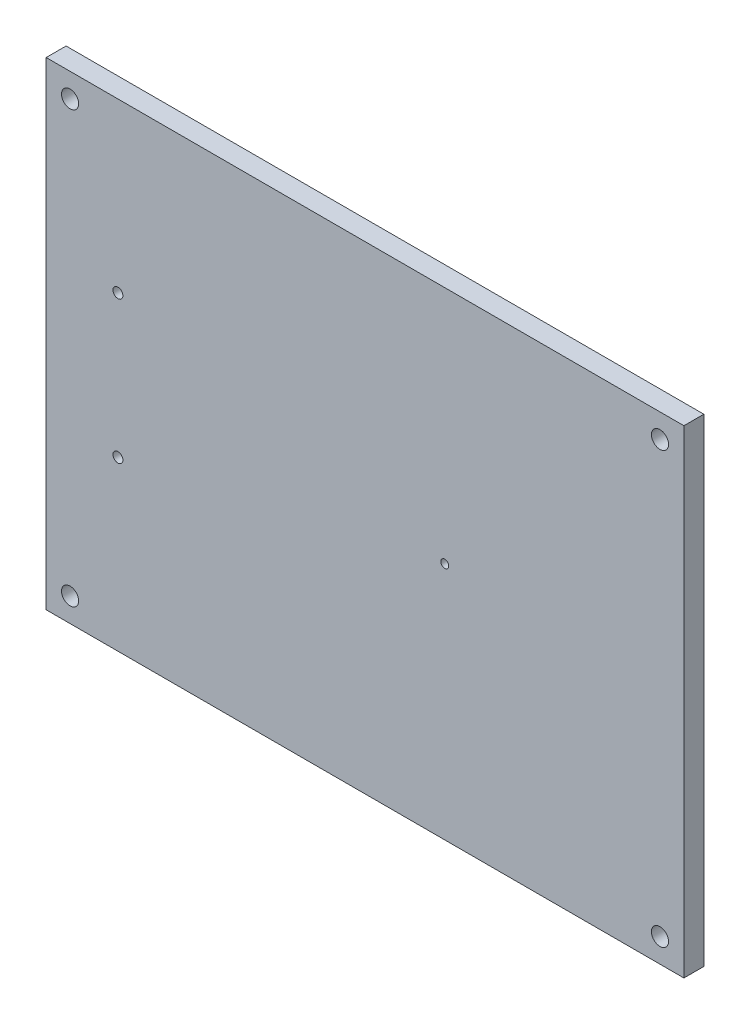
ISO-10303-21;
HEADER;
FILE_DESCRIPTION(('STEP AP214'),'2;1');
FILE_NAME('part.step','',(''),(''),'','','');
FILE_SCHEMA(('AUTOMOTIVE_DESIGN { 1 0 10303 214 1 1 1 1 }'));
ENDSEC;
DATA;
#1=APPLICATION_CONTEXT('core data for automotive mechanical design processes');
#2=APPLICATION_PROTOCOL_DEFINITION('international standard','automotive_design',2000,#1);
#3=PRODUCT_CONTEXT('',#1,'mechanical');
#4=PRODUCT('Part','Part','',(#3));
#5=PRODUCT_RELATED_PRODUCT_CATEGORY('part','',(#4));
#6=PRODUCT_DEFINITION_FORMATION('','',#4);
#7=PRODUCT_DEFINITION_CONTEXT('part definition',#1,'design');
#8=PRODUCT_DEFINITION('design','',#6,#7);
#9=PRODUCT_DEFINITION_SHAPE('','',#8);
#10=(LENGTH_UNIT() NAMED_UNIT(*) SI_UNIT(.MILLI.,.METRE.));
#11=(NAMED_UNIT(*) PLANE_ANGLE_UNIT() SI_UNIT($,.RADIAN.));
#12=(NAMED_UNIT(*) SI_UNIT($,.STERADIAN.) SOLID_ANGLE_UNIT());
#13=UNCERTAINTY_MEASURE_WITH_UNIT(LENGTH_MEASURE(1.E-05),#10,'distance_accuracy_value','');
#14=(GEOMETRIC_REPRESENTATION_CONTEXT(3) GLOBAL_UNCERTAINTY_ASSIGNED_CONTEXT((#13)) GLOBAL_UNIT_ASSIGNED_CONTEXT((#10,
#11,#12)) REPRESENTATION_CONTEXT('',''));
#15=CARTESIAN_POINT('',(0.,0.,0.));
#16=DIRECTION('',(0.,0.,1.));
#17=DIRECTION('',(1.,0.,0.));
#18=AXIS2_PLACEMENT_3D('',#15,#16,#17);
#19=CARTESIAN_POINT('',(0.,0.,5.));
#20=DIRECTION('',(0.,0.,1.));
#21=DIRECTION('',(1.,0.,0.));
#22=AXIS2_PLACEMENT_3D('',#19,#20,#21);
#23=PLANE('',#22);
#24=CARTESIAN_POINT('',(144.,59.,5.));
#25=DIRECTION('',(0.,0.,1.));
#26=DIRECTION('',(1.,0.,0.));
#27=AXIS2_PLACEMENT_3D('',#24,#25,#26);
#28=CIRCLE('',#27,2.15000000000001);
#29=CARTESIAN_POINT('',(146.15,59.,5.));
#30=VERTEX_POINT('',#29);
#31=EDGE_CURVE('E141',#30,#30,#28,.T.);
#32=ORIENTED_EDGE('',*,*,#31,.F.);
#33=EDGE_LOOP('',(#32));
#34=FACE_BOUND('',#33,.T.);
#35=CARTESIAN_POINT('',(-4.,-49.,5.));
#36=DIRECTION('',(0.,0.,1.));
#37=DIRECTION('',(1.,0.,0.));
#38=AXIS2_PLACEMENT_3D('',#35,#36,#37);
#39=CIRCLE('',#38,2.15);
#40=CARTESIAN_POINT('',(-1.85,-49.,5.));
#41=VERTEX_POINT('',#40);
#42=EDGE_CURVE('E129',#41,#41,#39,.T.);
#43=ORIENTED_EDGE('',*,*,#42,.F.);
#44=EDGE_LOOP('',(#43));
#45=FACE_BOUND('',#44,.T.);
#46=CARTESIAN_POINT('',(8.,-12.87,5.));
#47=DIRECTION('',(0.,0.,1.));
#48=DIRECTION('',(1.,0.,0.));
#49=AXIS2_PLACEMENT_3D('',#46,#47,#48);
#50=CIRCLE('',#49,1.25);
#51=CARTESIAN_POINT('',(9.25,-12.87,5.));
#52=VERTEX_POINT('',#51);
#53=EDGE_CURVE('E117',#52,#52,#50,.T.);
#54=ORIENTED_EDGE('',*,*,#53,.F.);
#55=EDGE_LOOP('',(#54));
#56=FACE_BOUND('',#55,.T.);
#57=DIRECTION('',(0.,-1.,0.));
#58=VECTOR('',#57,1.);
#59=CARTESIAN_POINT('',(-10.,65.,5.));
#60=LINE('',#59,#58);
#61=CARTESIAN_POINT('',(-10.,65.,5.));
#62=VERTEX_POINT('',#61);
#63=CARTESIAN_POINT('',(-10.,-55.,5.));
#64=VERTEX_POINT('',#63);
#65=EDGE_CURVE('E87',#62,#64,#60,.T.);
#66=ORIENTED_EDGE('',*,*,#65,.T.);
#67=DIRECTION('',(1.,0.,0.));
#68=VECTOR('',#67,1.);
#69=CARTESIAN_POINT('',(-10.,-55.,5.));
#70=LINE('',#69,#68);
#71=CARTESIAN_POINT('',(150.,-55.,5.));
#72=VERTEX_POINT('',#71);
#73=EDGE_CURVE('E82',#64,#72,#70,.T.);
#74=ORIENTED_EDGE('',*,*,#73,.T.);
#75=DIRECTION('',(0.,1.,0.));
#76=VECTOR('',#75,1.);
#77=CARTESIAN_POINT('',(150.,-55.,5.));
#78=LINE('',#77,#76);
#79=CARTESIAN_POINT('',(150.,65.,5.));
#80=VERTEX_POINT('',#79);
#81=EDGE_CURVE('E85',#72,#80,#78,.T.);
#82=ORIENTED_EDGE('',*,*,#81,.T.);
#83=DIRECTION('',(-1.,0.,0.));
#84=VECTOR('',#83,1.);
#85=CARTESIAN_POINT('',(150.,65.,5.));
#86=LINE('',#85,#84);
#87=EDGE_CURVE('E52',#80,#62,#86,.T.);
#88=ORIENTED_EDGE('',*,*,#87,.T.);
#89=EDGE_LOOP('',(#66,#74,#82,#88));
#90=FACE_BOUND('',#89,.T.);
#91=CARTESIAN_POINT('',(90.,5.,5.));
#92=DIRECTION('',(0.,0.,1.));
#93=DIRECTION('',(1.,0.,0.));
#94=AXIS2_PLACEMENT_3D('',#91,#92,#93);
#95=CIRCLE('',#94,1.);
#96=CARTESIAN_POINT('',(91.,5.,5.));
#97=VERTEX_POINT('',#96);
#98=EDGE_CURVE('E102',#97,#97,#95,.T.);
#99=ORIENTED_EDGE('',*,*,#98,.F.);
#100=EDGE_LOOP('',(#99));
#101=FACE_BOUND('',#100,.T.);
#102=CARTESIAN_POINT('',(8.,22.87,5.));
#103=DIRECTION('',(0.,0.,1.));
#104=DIRECTION('',(1.,0.,0.));
#105=AXIS2_PLACEMENT_3D('',#102,#103,#104);
#106=CIRCLE('',#105,1.25);
#107=CARTESIAN_POINT('',(9.25,22.87,5.));
#108=VERTEX_POINT('',#107);
#109=EDGE_CURVE('E123',#108,#108,#106,.T.);
#110=ORIENTED_EDGE('',*,*,#109,.F.);
#111=EDGE_LOOP('',(#110));
#112=FACE_BOUND('',#111,.T.);
#113=CARTESIAN_POINT('',(144.,-49.,5.));
#114=DIRECTION('',(0.,0.,1.));
#115=DIRECTION('',(1.,0.,0.));
#116=AXIS2_PLACEMENT_3D('',#113,#114,#115);
#117=CIRCLE('',#116,2.15000000000001);
#118=CARTESIAN_POINT('',(146.15,-49.,5.));
#119=VERTEX_POINT('',#118);
#120=EDGE_CURVE('E135',#119,#119,#117,.T.);
#121=ORIENTED_EDGE('',*,*,#120,.F.);
#122=EDGE_LOOP('',(#121));
#123=FACE_BOUND('',#122,.T.);
#124=CARTESIAN_POINT('',(-4.,59.,5.));
#125=DIRECTION('',(0.,0.,1.));
#126=DIRECTION('',(1.,0.,0.));
#127=AXIS2_PLACEMENT_3D('',#124,#125,#126);
#128=CIRCLE('',#127,2.15);
#129=CARTESIAN_POINT('',(-1.85,59.,5.));
#130=VERTEX_POINT('',#129);
#131=EDGE_CURVE('E147',#130,#130,#128,.T.);
#132=ORIENTED_EDGE('',*,*,#131,.F.);
#133=EDGE_LOOP('',(#132));
#134=FACE_BOUND('',#133,.T.);
#135=ADVANCED_FACE('F35',(#34,#45,#56,#90,#101,#112,#123,#134),#23,.T.);
#136=CARTESIAN_POINT('',(0.,0.,0.));
#137=DIRECTION('',(0.,0.,1.));
#138=DIRECTION('',(1.,0.,0.));
#139=AXIS2_PLACEMENT_3D('',#136,#137,#138);
#140=PLANE('',#139);
#141=DIRECTION('',(0.,-1.,0.));
#142=VECTOR('',#141,1.);
#143=CARTESIAN_POINT('',(-10.,65.,0.));
#144=LINE('',#143,#142);
#145=CARTESIAN_POINT('',(-10.,65.,0.));
#146=VERTEX_POINT('',#145);
#147=CARTESIAN_POINT('',(-10.,-55.,0.));
#148=VERTEX_POINT('',#147);
#149=EDGE_CURVE('E99',#146,#148,#144,.T.);
#150=ORIENTED_EDGE('',*,*,#149,.F.);
#151=DIRECTION('',(-1.,0.,0.));
#152=VECTOR('',#151,1.);
#153=CARTESIAN_POINT('',(150.,65.,0.));
#154=LINE('',#153,#152);
#155=CARTESIAN_POINT('',(150.,65.,0.));
#156=VERTEX_POINT('',#155);
#157=EDGE_CURVE('E75',#156,#146,#154,.T.);
#158=ORIENTED_EDGE('',*,*,#157,.F.);
#159=DIRECTION('',(0.,1.,0.));
#160=VECTOR('',#159,1.);
#161=CARTESIAN_POINT('',(150.,-55.,0.));
#162=LINE('',#161,#160);
#163=CARTESIAN_POINT('',(150.,-55.,0.));
#164=VERTEX_POINT('',#163);
#165=EDGE_CURVE('E69',#164,#156,#162,.T.);
#166=ORIENTED_EDGE('',*,*,#165,.F.);
#167=DIRECTION('',(1.,0.,0.));
#168=VECTOR('',#167,1.);
#169=CARTESIAN_POINT('',(-10.,-55.,0.));
#170=LINE('',#169,#168);
#171=EDGE_CURVE('E91',#148,#164,#170,.T.);
#172=ORIENTED_EDGE('',*,*,#171,.F.);
#173=EDGE_LOOP('',(#150,#158,#166,#172));
#174=FACE_BOUND('',#173,.T.);
#175=CARTESIAN_POINT('',(90.,5.,0.));
#176=DIRECTION('',(0.,0.,1.));
#177=DIRECTION('',(1.,0.,0.));
#178=AXIS2_PLACEMENT_3D('',#175,#176,#177);
#179=CIRCLE('',#178,1.);
#180=CARTESIAN_POINT('',(91.,5.,0.));
#181=VERTEX_POINT('',#180);
#182=EDGE_CURVE('E114',#181,#181,#179,.T.);
#183=ORIENTED_EDGE('',*,*,#182,.T.);
#184=EDGE_LOOP('',(#183));
#185=FACE_BOUND('',#184,.T.);
#186=CARTESIAN_POINT('',(8.,-12.87,0.));
#187=DIRECTION('',(0.,0.,1.));
#188=DIRECTION('',(1.,0.,0.));
#189=AXIS2_PLACEMENT_3D('',#186,#187,#188);
#190=CIRCLE('',#189,1.25);
#191=CARTESIAN_POINT('',(9.25,-12.87,0.));
#192=VERTEX_POINT('',#191);
#193=EDGE_CURVE('E120',#192,#192,#190,.T.);
#194=ORIENTED_EDGE('',*,*,#193,.T.);
#195=EDGE_LOOP('',(#194));
#196=FACE_BOUND('',#195,.T.);
#197=CARTESIAN_POINT('',(8.,22.87,0.));
#198=DIRECTION('',(0.,0.,1.));
#199=DIRECTION('',(1.,0.,0.));
#200=AXIS2_PLACEMENT_3D('',#197,#198,#199);
#201=CIRCLE('',#200,1.25);
#202=CARTESIAN_POINT('',(9.25,22.87,0.));
#203=VERTEX_POINT('',#202);
#204=EDGE_CURVE('E126',#203,#203,#201,.T.);
#205=ORIENTED_EDGE('',*,*,#204,.T.);
#206=EDGE_LOOP('',(#205));
#207=FACE_BOUND('',#206,.T.);
#208=CARTESIAN_POINT('',(-4.,-49.,0.));
#209=DIRECTION('',(0.,0.,1.));
#210=DIRECTION('',(1.,0.,0.));
#211=AXIS2_PLACEMENT_3D('',#208,#209,#210);
#212=CIRCLE('',#211,2.15);
#213=CARTESIAN_POINT('',(-1.85,-49.,0.));
#214=VERTEX_POINT('',#213);
#215=EDGE_CURVE('E132',#214,#214,#212,.T.);
#216=ORIENTED_EDGE('',*,*,#215,.T.);
#217=EDGE_LOOP('',(#216));
#218=FACE_BOUND('',#217,.T.);
#219=CARTESIAN_POINT('',(144.,-49.,0.));
#220=DIRECTION('',(0.,0.,1.));
#221=DIRECTION('',(1.,0.,0.));
#222=AXIS2_PLACEMENT_3D('',#219,#220,#221);
#223=CIRCLE('',#222,2.15000000000001);
#224=CARTESIAN_POINT('',(146.15,-49.,0.));
#225=VERTEX_POINT('',#224);
#226=EDGE_CURVE('E138',#225,#225,#223,.T.);
#227=ORIENTED_EDGE('',*,*,#226,.T.);
#228=EDGE_LOOP('',(#227));
#229=FACE_BOUND('',#228,.T.);
#230=CARTESIAN_POINT('',(144.,59.,0.));
#231=DIRECTION('',(0.,0.,1.));
#232=DIRECTION('',(1.,0.,0.));
#233=AXIS2_PLACEMENT_3D('',#230,#231,#232);
#234=CIRCLE('',#233,2.15000000000001);
#235=CARTESIAN_POINT('',(146.15,59.,0.));
#236=VERTEX_POINT('',#235);
#237=EDGE_CURVE('E144',#236,#236,#234,.T.);
#238=ORIENTED_EDGE('',*,*,#237,.T.);
#239=EDGE_LOOP('',(#238));
#240=FACE_BOUND('',#239,.T.);
#241=CARTESIAN_POINT('',(-4.,59.,0.));
#242=DIRECTION('',(0.,0.,1.));
#243=DIRECTION('',(1.,0.,0.));
#244=AXIS2_PLACEMENT_3D('',#241,#242,#243);
#245=CIRCLE('',#244,2.15);
#246=CARTESIAN_POINT('',(-1.85,59.,0.));
#247=VERTEX_POINT('',#246);
#248=EDGE_CURVE('E150',#247,#247,#245,.T.);
#249=ORIENTED_EDGE('',*,*,#248,.T.);
#250=EDGE_LOOP('',(#249));
#251=FACE_BOUND('',#250,.T.);
#252=ADVANCED_FACE('F110',(#174,#185,#196,#207,#218,#229,#240,#251),#140,.F.);
#253=CARTESIAN_POINT('',(-10.,65.,5.));
#254=DIRECTION('',(1.,0.,0.));
#255=DIRECTION('',(0.,0.,-1.));
#256=AXIS2_PLACEMENT_3D('',#253,#254,#255);
#257=PLANE('',#256);
#258=ORIENTED_EDGE('',*,*,#149,.T.);
#259=DIRECTION('',(0.,0.,-1.));
#260=VECTOR('',#259,1.);
#261=CARTESIAN_POINT('',(-10.,-55.,5.));
#262=LINE('',#261,#260);
#263=EDGE_CURVE('E11',#64,#148,#262,.T.);
#264=ORIENTED_EDGE('',*,*,#263,.F.);
#265=ORIENTED_EDGE('',*,*,#65,.F.);
#266=DIRECTION('',(0.,0.,-1.));
#267=VECTOR('',#266,1.);
#268=CARTESIAN_POINT('',(-10.,65.,5.));
#269=LINE('',#268,#267);
#270=EDGE_CURVE('E95',#62,#146,#269,.T.);
#271=ORIENTED_EDGE('',*,*,#270,.T.);
#272=EDGE_LOOP('',(#258,#264,#265,#271));
#273=FACE_BOUND('',#272,.T.);
#274=ADVANCED_FACE('F37',(#273),#257,.F.);
#275=CARTESIAN_POINT('',(-10.,-55.,5.));
#276=DIRECTION('',(0.,1.,0.));
#277=DIRECTION('',(0.,0.,1.));
#278=AXIS2_PLACEMENT_3D('',#275,#276,#277);
#279=PLANE('',#278);
#280=ORIENTED_EDGE('',*,*,#171,.T.);
#281=DIRECTION('',(0.,0.,-1.));
#282=VECTOR('',#281,1.);
#283=CARTESIAN_POINT('',(150.,-55.,5.));
#284=LINE('',#283,#282);
#285=EDGE_CURVE('E44',#72,#164,#284,.T.);
#286=ORIENTED_EDGE('',*,*,#285,.F.);
#287=ORIENTED_EDGE('',*,*,#73,.F.);
#288=ORIENTED_EDGE('',*,*,#263,.T.);
#289=EDGE_LOOP('',(#280,#286,#287,#288));
#290=FACE_BOUND('',#289,.T.);
#291=ADVANCED_FACE('F90',(#290),#279,.F.);
#292=CARTESIAN_POINT('',(150.,-55.,5.));
#293=DIRECTION('',(-1.,0.,0.));
#294=DIRECTION('',(0.,0.,1.));
#295=AXIS2_PLACEMENT_3D('',#292,#293,#294);
#296=PLANE('',#295);
#297=ORIENTED_EDGE('',*,*,#165,.T.);
#298=DIRECTION('',(0.,0.,-1.));
#299=VECTOR('',#298,1.);
#300=CARTESIAN_POINT('',(150.,65.,5.));
#301=LINE('',#300,#299);
#302=EDGE_CURVE('E92',#80,#156,#301,.T.);
#303=ORIENTED_EDGE('',*,*,#302,.F.);
#304=ORIENTED_EDGE('',*,*,#81,.F.);
#305=ORIENTED_EDGE('',*,*,#285,.T.);
#306=EDGE_LOOP('',(#297,#303,#304,#305));
#307=FACE_BOUND('',#306,.T.);
#308=ADVANCED_FACE('F93',(#307),#296,.F.);
#309=CARTESIAN_POINT('',(150.,65.,5.));
#310=DIRECTION('',(0.,-1.,0.));
#311=DIRECTION('',(0.,0.,-1.));
#312=AXIS2_PLACEMENT_3D('',#309,#310,#311);
#313=PLANE('',#312);
#314=ORIENTED_EDGE('',*,*,#157,.T.);
#315=ORIENTED_EDGE('',*,*,#270,.F.);
#316=ORIENTED_EDGE('',*,*,#87,.F.);
#317=ORIENTED_EDGE('',*,*,#302,.T.);
#318=EDGE_LOOP('',(#314,#315,#316,#317));
#319=FACE_BOUND('',#318,.T.);
#320=ADVANCED_FACE('F107',(#319),#313,.F.);
#321=CARTESIAN_POINT('',(90.,5.,5.));
#322=DIRECTION('',(0.,0.,-1.));
#323=DIRECTION('',(-1.,0.,0.));
#324=AXIS2_PLACEMENT_3D('',#321,#322,#323);
#325=CYLINDRICAL_SURFACE('',#324,1.);
#326=ORIENTED_EDGE('',*,*,#98,.T.);
#327=EDGE_LOOP('',(#326));
#328=FACE_BOUND('',#327,.T.);
#329=ORIENTED_EDGE('',*,*,#182,.F.);
#330=EDGE_LOOP('',(#329));
#331=FACE_BOUND('',#330,.T.);
#332=ADVANCED_FACE('F169',(#328,#331),#325,.F.);
#333=CARTESIAN_POINT('',(8.,-12.87,5.));
#334=DIRECTION('',(0.,0.,-1.));
#335=DIRECTION('',(-1.,0.,0.));
#336=AXIS2_PLACEMENT_3D('',#333,#334,#335);
#337=CYLINDRICAL_SURFACE('',#336,1.25);
#338=ORIENTED_EDGE('',*,*,#53,.T.);
#339=EDGE_LOOP('',(#338));
#340=FACE_BOUND('',#339,.T.);
#341=ORIENTED_EDGE('',*,*,#193,.F.);
#342=EDGE_LOOP('',(#341));
#343=FACE_BOUND('',#342,.T.);
#344=ADVANCED_FACE('F215',(#340,#343),#337,.F.);
#345=CARTESIAN_POINT('',(8.,22.87,5.));
#346=DIRECTION('',(0.,0.,-1.));
#347=DIRECTION('',(-1.,0.,0.));
#348=AXIS2_PLACEMENT_3D('',#345,#346,#347);
#349=CYLINDRICAL_SURFACE('',#348,1.25);
#350=ORIENTED_EDGE('',*,*,#109,.T.);
#351=EDGE_LOOP('',(#350));
#352=FACE_BOUND('',#351,.T.);
#353=ORIENTED_EDGE('',*,*,#204,.F.);
#354=EDGE_LOOP('',(#353));
#355=FACE_BOUND('',#354,.T.);
#356=ADVANCED_FACE('F223',(#352,#355),#349,.F.);
#357=CARTESIAN_POINT('',(-4.,-49.,5.));
#358=DIRECTION('',(0.,0.,-1.));
#359=DIRECTION('',(-1.,0.,0.));
#360=AXIS2_PLACEMENT_3D('',#357,#358,#359);
#361=CYLINDRICAL_SURFACE('',#360,2.15);
#362=ORIENTED_EDGE('',*,*,#42,.T.);
#363=EDGE_LOOP('',(#362));
#364=FACE_BOUND('',#363,.T.);
#365=ORIENTED_EDGE('',*,*,#215,.F.);
#366=EDGE_LOOP('',(#365));
#367=FACE_BOUND('',#366,.T.);
#368=ADVANCED_FACE('F231',(#364,#367),#361,.F.);
#369=CARTESIAN_POINT('',(144.,-49.,5.));
#370=DIRECTION('',(0.,0.,-1.));
#371=DIRECTION('',(-1.,0.,0.));
#372=AXIS2_PLACEMENT_3D('',#369,#370,#371);
#373=CYLINDRICAL_SURFACE('',#372,2.15000000000001);
#374=ORIENTED_EDGE('',*,*,#120,.T.);
#375=EDGE_LOOP('',(#374));
#376=FACE_BOUND('',#375,.T.);
#377=ORIENTED_EDGE('',*,*,#226,.F.);
#378=EDGE_LOOP('',(#377));
#379=FACE_BOUND('',#378,.T.);
#380=ADVANCED_FACE('F240',(#376,#379),#373,.F.);
#381=CARTESIAN_POINT('',(144.,59.,5.));
#382=DIRECTION('',(0.,0.,-1.));
#383=DIRECTION('',(-1.,0.,0.));
#384=AXIS2_PLACEMENT_3D('',#381,#382,#383);
#385=CYLINDRICAL_SURFACE('',#384,2.15000000000001);
#386=ORIENTED_EDGE('',*,*,#31,.T.);
#387=EDGE_LOOP('',(#386));
#388=FACE_BOUND('',#387,.T.);
#389=ORIENTED_EDGE('',*,*,#237,.F.);
#390=EDGE_LOOP('',(#389));
#391=FACE_BOUND('',#390,.T.);
#392=ADVANCED_FACE('F249',(#388,#391),#385,.F.);
#393=CARTESIAN_POINT('',(-4.,59.,5.));
#394=DIRECTION('',(0.,0.,-1.));
#395=DIRECTION('',(-1.,0.,0.));
#396=AXIS2_PLACEMENT_3D('',#393,#394,#395);
#397=CYLINDRICAL_SURFACE('',#396,2.15);
#398=ORIENTED_EDGE('',*,*,#131,.T.);
#399=EDGE_LOOP('',(#398));
#400=FACE_BOUND('',#399,.T.);
#401=ORIENTED_EDGE('',*,*,#248,.F.);
#402=EDGE_LOOP('',(#401));
#403=FACE_BOUND('',#402,.T.);
#404=ADVANCED_FACE('F156',(#400,#403),#397,.F.);
#405=CLOSED_SHELL('',(#135,#252,#274,#291,#308,#320,#332,#344,#356,#368,#380,#392,#404));
#406=MANIFOLD_SOLID_BREP('B2',#405);
#407=ADVANCED_BREP_SHAPE_REPRESENTATION('',(#18,#406),#14);
#408=SHAPE_DEFINITION_REPRESENTATION(#9,#407);
ENDSEC;
END-ISO-10303-21;
